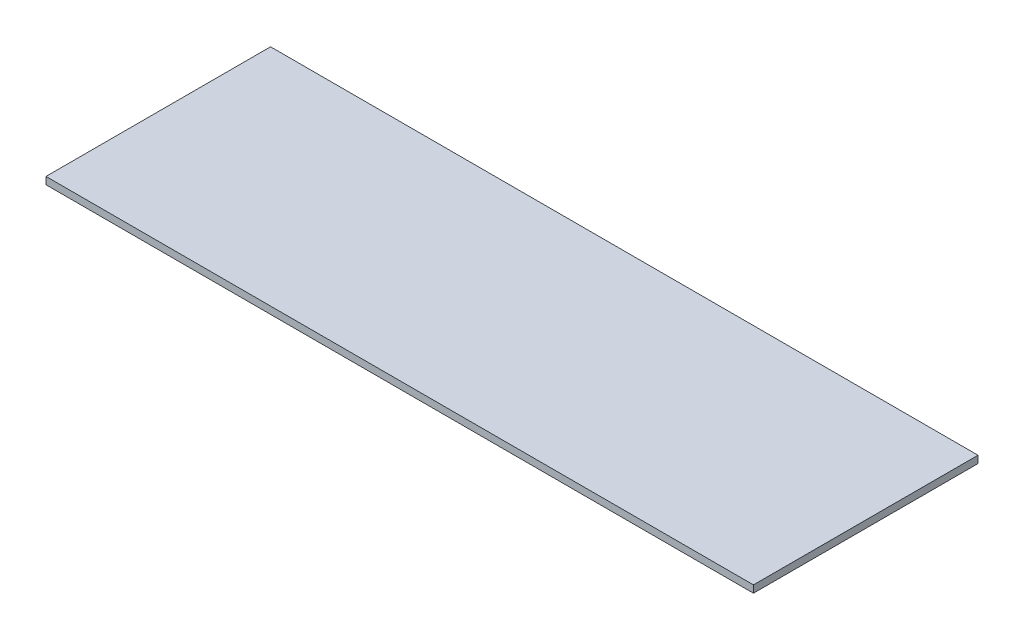
ISO-10303-21;
HEADER;
FILE_DESCRIPTION(('STEP AP214'),'2;1');
FILE_NAME('part.step','',(''),(''),'','','');
FILE_SCHEMA(('AUTOMOTIVE_DESIGN { 1 0 10303 214 1 1 1 1 }'));
ENDSEC;
DATA;
#1=APPLICATION_CONTEXT('core data for automotive mechanical design processes');
#2=APPLICATION_PROTOCOL_DEFINITION('international standard','automotive_design',2000,#1);
#3=PRODUCT_CONTEXT('',#1,'mechanical');
#4=PRODUCT('Part','Part','',(#3));
#5=PRODUCT_RELATED_PRODUCT_CATEGORY('part','',(#4));
#6=PRODUCT_DEFINITION_FORMATION('','',#4);
#7=PRODUCT_DEFINITION_CONTEXT('part definition',#1,'design');
#8=PRODUCT_DEFINITION('design','',#6,#7);
#9=PRODUCT_DEFINITION_SHAPE('','',#8);
#10=(LENGTH_UNIT() NAMED_UNIT(*) SI_UNIT(.MILLI.,.METRE.));
#11=(NAMED_UNIT(*) PLANE_ANGLE_UNIT() SI_UNIT($,.RADIAN.));
#12=(NAMED_UNIT(*) SI_UNIT($,.STERADIAN.) SOLID_ANGLE_UNIT());
#13=UNCERTAINTY_MEASURE_WITH_UNIT(LENGTH_MEASURE(1.E-05),#10,'distance_accuracy_value','');
#14=(GEOMETRIC_REPRESENTATION_CONTEXT(3) GLOBAL_UNCERTAINTY_ASSIGNED_CONTEXT((#13)) GLOBAL_UNIT_ASSIGNED_CONTEXT((#10,
#11,#12)) REPRESENTATION_CONTEXT('',''));
#15=CARTESIAN_POINT('',(0.,0.,0.));
#16=DIRECTION('',(0.,0.,1.));
#17=DIRECTION('',(1.,0.,0.));
#18=AXIS2_PLACEMENT_3D('',#15,#16,#17);
#19=CARTESIAN_POINT('',(0.,3.,0.));
#20=DIRECTION('',(1.,0.,0.));
#21=DIRECTION('',(0.,0.,-1.));
#22=AXIS2_PLACEMENT_3D('',#19,#20,#21);
#23=PLANE('',#22);
#24=DIRECTION('',(0.,0.,1.));
#25=VECTOR('',#24,1.);
#26=CARTESIAN_POINT('',(0.,0.,0.));
#27=LINE('',#26,#25);
#28=CARTESIAN_POINT('',(0.,0.,-93.));
#29=VERTEX_POINT('',#28);
#30=CARTESIAN_POINT('',(0.,0.,0.));
#31=VERTEX_POINT('',#30);
#32=EDGE_CURVE('E111',#29,#31,#27,.T.);
#33=ORIENTED_EDGE('',*,*,#32,.T.);
#34=DIRECTION('',(0.,-1.,0.));
#35=VECTOR('',#34,1.);
#36=CARTESIAN_POINT('',(0.,3.,0.));
#37=LINE('',#36,#35);
#38=CARTESIAN_POINT('',(0.,3.,0.));
#39=VERTEX_POINT('',#38);
#40=EDGE_CURVE('E11',#39,#31,#37,.T.);
#41=ORIENTED_EDGE('',*,*,#40,.F.);
#42=DIRECTION('',(0.,0.,1.));
#43=VECTOR('',#42,1.);
#44=CARTESIAN_POINT('',(0.,3.,0.));
#45=LINE('',#44,#43);
#46=CARTESIAN_POINT('',(0.,3.,-93.));
#47=VERTEX_POINT('',#46);
#48=EDGE_CURVE('E95',#47,#39,#45,.T.);
#49=ORIENTED_EDGE('',*,*,#48,.F.);
#50=DIRECTION('',(0.,-1.,0.));
#51=VECTOR('',#50,1.);
#52=CARTESIAN_POINT('',(0.,3.,-93.));
#53=LINE('',#52,#51);
#54=EDGE_CURVE('E107',#47,#29,#53,.T.);
#55=ORIENTED_EDGE('',*,*,#54,.T.);
#56=EDGE_LOOP('',(#33,#41,#49,#55));
#57=FACE_BOUND('',#56,.T.);
#58=ADVANCED_FACE('F43',(#57),#23,.F.);
#59=CARTESIAN_POINT('',(0.,3.,0.));
#60=DIRECTION('',(0.,0.,-1.));
#61=DIRECTION('',(-1.,0.,0.));
#62=AXIS2_PLACEMENT_3D('',#59,#60,#61);
#63=PLANE('',#62);
#64=DIRECTION('',(1.,0.,0.));
#65=VECTOR('',#64,1.);
#66=CARTESIAN_POINT('',(0.,0.,0.));
#67=LINE('',#66,#65);
#68=CARTESIAN_POINT('',(293.,0.,0.));
#69=VERTEX_POINT('',#68);
#70=EDGE_CURVE('E100',#31,#69,#67,.T.);
#71=ORIENTED_EDGE('',*,*,#70,.T.);
#72=DIRECTION('',(0.,-1.,0.));
#73=VECTOR('',#72,1.);
#74=CARTESIAN_POINT('',(293.,3.,0.));
#75=LINE('',#74,#73);
#76=CARTESIAN_POINT('',(293.,3.,0.));
#77=VERTEX_POINT('',#76);
#78=EDGE_CURVE('E52',#77,#69,#75,.T.);
#79=ORIENTED_EDGE('',*,*,#78,.F.);
#80=DIRECTION('',(1.,0.,0.));
#81=VECTOR('',#80,1.);
#82=CARTESIAN_POINT('',(0.,3.,0.));
#83=LINE('',#82,#81);
#84=EDGE_CURVE('E90',#39,#77,#83,.T.);
#85=ORIENTED_EDGE('',*,*,#84,.F.);
#86=ORIENTED_EDGE('',*,*,#40,.T.);
#87=EDGE_LOOP('',(#71,#79,#85,#86));
#88=FACE_BOUND('',#87,.T.);
#89=ADVANCED_FACE('F99',(#88),#63,.F.);
#90=CARTESIAN_POINT('',(293.,3.,0.));
#91=DIRECTION('',(-1.,0.,0.));
#92=DIRECTION('',(0.,0.,1.));
#93=AXIS2_PLACEMENT_3D('',#90,#91,#92);
#94=PLANE('',#93);
#95=DIRECTION('',(0.,0.,-1.));
#96=VECTOR('',#95,1.);
#97=CARTESIAN_POINT('',(293.,0.,0.));
#98=LINE('',#97,#96);
#99=CARTESIAN_POINT('',(293.,0.,-93.));
#100=VERTEX_POINT('',#99);
#101=EDGE_CURVE('E77',#69,#100,#98,.T.);
#102=ORIENTED_EDGE('',*,*,#101,.T.);
#103=DIRECTION('',(0.,-1.,0.));
#104=VECTOR('',#103,1.);
#105=CARTESIAN_POINT('',(293.,3.,-93.));
#106=LINE('',#105,#104);
#107=CARTESIAN_POINT('',(293.,3.,-93.));
#108=VERTEX_POINT('',#107);
#109=EDGE_CURVE('E102',#108,#100,#106,.T.);
#110=ORIENTED_EDGE('',*,*,#109,.F.);
#111=DIRECTION('',(0.,0.,-1.));
#112=VECTOR('',#111,1.);
#113=CARTESIAN_POINT('',(293.,3.,0.));
#114=LINE('',#113,#112);
#115=EDGE_CURVE('E93',#77,#108,#114,.T.);
#116=ORIENTED_EDGE('',*,*,#115,.F.);
#117=ORIENTED_EDGE('',*,*,#78,.T.);
#118=EDGE_LOOP('',(#102,#110,#116,#117));
#119=FACE_BOUND('',#118,.T.);
#120=ADVANCED_FACE('F103',(#119),#94,.F.);
#121=CARTESIAN_POINT('',(0.,3.,-93.));
#122=DIRECTION('',(0.,0.,1.));
#123=DIRECTION('',(1.,0.,0.));
#124=AXIS2_PLACEMENT_3D('',#121,#122,#123);
#125=PLANE('',#124);
#126=DIRECTION('',(-1.,0.,0.));
#127=VECTOR('',#126,1.);
#128=CARTESIAN_POINT('',(0.,0.,-93.));
#129=LINE('',#128,#127);
#130=EDGE_CURVE('E83',#100,#29,#129,.T.);
#131=ORIENTED_EDGE('',*,*,#130,.T.);
#132=ORIENTED_EDGE('',*,*,#54,.F.);
#133=DIRECTION('',(-1.,0.,0.));
#134=VECTOR('',#133,1.);
#135=CARTESIAN_POINT('',(0.,3.,-93.));
#136=LINE('',#135,#134);
#137=EDGE_CURVE('E60',#108,#47,#136,.T.);
#138=ORIENTED_EDGE('',*,*,#137,.F.);
#139=ORIENTED_EDGE('',*,*,#109,.T.);
#140=EDGE_LOOP('',(#131,#132,#138,#139));
#141=FACE_BOUND('',#140,.T.);
#142=ADVANCED_FACE('F124',(#141),#125,.F.);
#143=CARTESIAN_POINT('',(0.,3.,0.));
#144=DIRECTION('',(0.,-1.,0.));
#145=DIRECTION('',(0.,0.,-1.));
#146=AXIS2_PLACEMENT_3D('',#143,#144,#145);
#147=PLANE('',#146);
#148=ORIENTED_EDGE('',*,*,#48,.T.);
#149=ORIENTED_EDGE('',*,*,#84,.T.);
#150=ORIENTED_EDGE('',*,*,#115,.T.);
#151=ORIENTED_EDGE('',*,*,#137,.T.);
#152=EDGE_LOOP('',(#148,#149,#150,#151));
#153=FACE_BOUND('',#152,.T.);
#154=ADVANCED_FACE('F91',(#153),#147,.F.);
#155=CARTESIAN_POINT('',(0.,0.,0.));
#156=DIRECTION('',(0.,-1.,0.));
#157=DIRECTION('',(0.,0.,-1.));
#158=AXIS2_PLACEMENT_3D('',#155,#156,#157);
#159=PLANE('',#158);
#160=ORIENTED_EDGE('',*,*,#32,.F.);
#161=ORIENTED_EDGE('',*,*,#130,.F.);
#162=ORIENTED_EDGE('',*,*,#101,.F.);
#163=ORIENTED_EDGE('',*,*,#70,.F.);
#164=EDGE_LOOP('',(#160,#161,#162,#163));
#165=FACE_BOUND('',#164,.T.);
#166=ADVANCED_FACE('F127',(#165),#159,.T.);
#167=CLOSED_SHELL('',(#58,#89,#120,#142,#154,#166));
#168=MANIFOLD_SOLID_BREP('B2',#167);
#169=ADVANCED_BREP_SHAPE_REPRESENTATION('',(#18,#168),#14);
#170=SHAPE_DEFINITION_REPRESENTATION(#9,#169);
ENDSEC;
END-ISO-10303-21;
